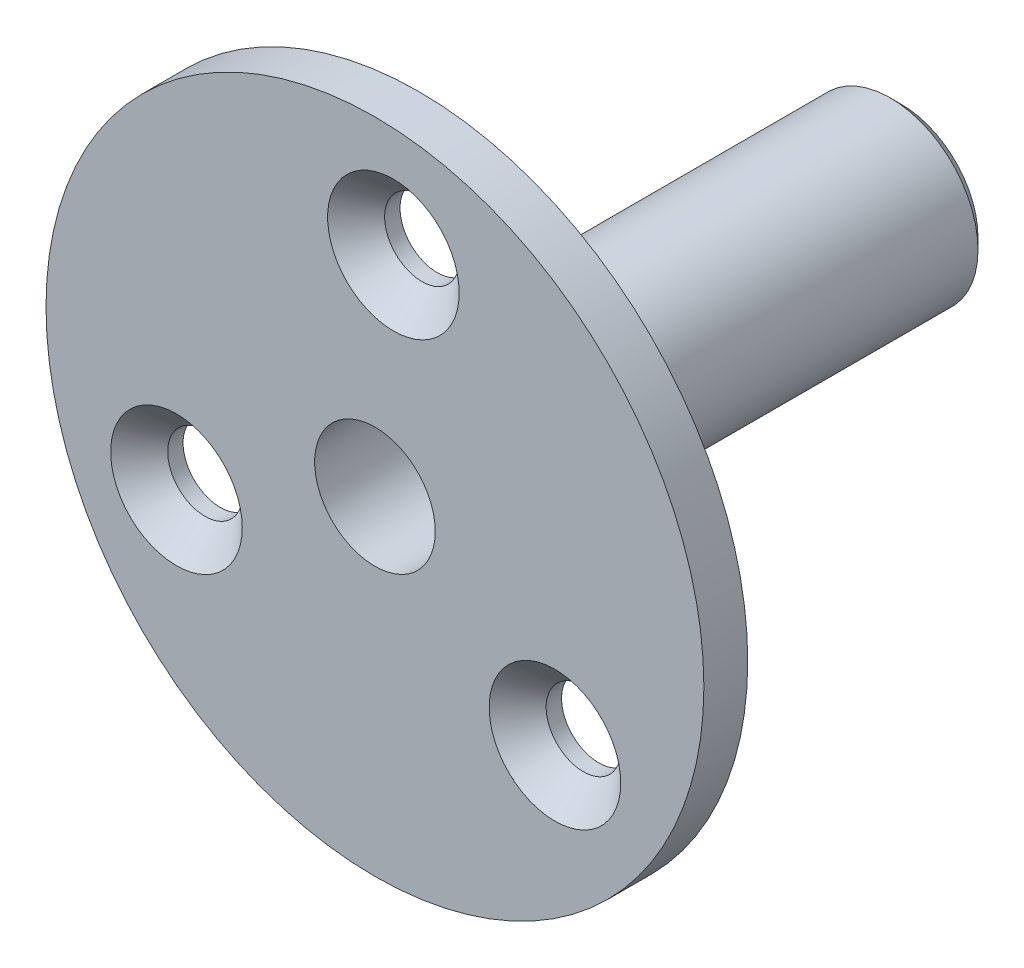
ISO-10303-21;
HEADER;
FILE_DESCRIPTION(('STEP AP214'),'2;1');
FILE_NAME('part.step','',(''),(''),'','','');
FILE_SCHEMA(('AUTOMOTIVE_DESIGN { 1 0 10303 214 1 1 1 1 }'));
ENDSEC;
DATA;
#1=APPLICATION_CONTEXT('core data for automotive mechanical design processes');
#2=APPLICATION_PROTOCOL_DEFINITION('international standard','automotive_design',2000,#1);
#3=PRODUCT_CONTEXT('',#1,'mechanical');
#4=PRODUCT('Part','Part','',(#3));
#5=PRODUCT_RELATED_PRODUCT_CATEGORY('part','',(#4));
#6=PRODUCT_DEFINITION_FORMATION('','',#4);
#7=PRODUCT_DEFINITION_CONTEXT('part definition',#1,'design');
#8=PRODUCT_DEFINITION('design','',#6,#7);
#9=PRODUCT_DEFINITION_SHAPE('','',#8);
#10=(LENGTH_UNIT() NAMED_UNIT(*) SI_UNIT(.MILLI.,.METRE.));
#11=(NAMED_UNIT(*) PLANE_ANGLE_UNIT() SI_UNIT($,.RADIAN.));
#12=(NAMED_UNIT(*) SI_UNIT($,.STERADIAN.) SOLID_ANGLE_UNIT());
#13=UNCERTAINTY_MEASURE_WITH_UNIT(LENGTH_MEASURE(1.E-05),#10,'distance_accuracy_value','');
#14=(GEOMETRIC_REPRESENTATION_CONTEXT(3) GLOBAL_UNCERTAINTY_ASSIGNED_CONTEXT((#13)) GLOBAL_UNIT_ASSIGNED_CONTEXT((#10,
#11,#12)) REPRESENTATION_CONTEXT('',''));
#15=CARTESIAN_POINT('',(0.,0.,0.));
#16=DIRECTION('',(0.,0.,1.));
#17=DIRECTION('',(1.,0.,0.));
#18=AXIS2_PLACEMENT_3D('',#15,#16,#17);
#19=CARTESIAN_POINT('',(0.,0.,2.));
#20=DIRECTION('',(0.,0.,1.));
#21=DIRECTION('',(1.,0.,0.));
#22=AXIS2_PLACEMENT_3D('',#19,#20,#21);
#23=PLANE('',#22);
#24=CARTESIAN_POINT('',(8.20835559815152,-5.7116458551187,2.));
#25=DIRECTION('',(0.,0.,1.));
#26=DIRECTION('',(1.,0.,0.));
#27=AXIS2_PLACEMENT_3D('',#24,#25,#26);
#28=CIRCLE('',#27,3.);
#29=CARTESIAN_POINT('',(11.2083555981515,-5.7116458551187,2.));
#30=VERTEX_POINT('',#29);
#31=EDGE_CURVE('E54',#30,#30,#28,.T.);
#32=ORIENTED_EDGE('',*,*,#31,.F.);
#33=EDGE_LOOP('',(#32));
#34=FACE_BOUND('',#33,.T.);
#35=CARTESIAN_POINT('',(0.,0.,2.));
#36=DIRECTION('',(0.,0.,1.));
#37=DIRECTION('',(1.,0.,0.));
#38=AXIS2_PLACEMENT_3D('',#35,#36,#37);
#39=CIRCLE('',#38,2.75);
#40=CARTESIAN_POINT('',(2.75,0.,2.));
#41=VERTEX_POINT('',#40);
#42=EDGE_CURVE('E63',#41,#41,#39,.T.);
#43=ORIENTED_EDGE('',*,*,#42,.F.);
#44=EDGE_LOOP('',(#43));
#45=FACE_BOUND('',#44,.T.);
#46=CARTESIAN_POINT('',(0.,0.,2.));
#47=DIRECTION('',(0.,0.,1.));
#48=DIRECTION('',(1.,0.,0.));
#49=AXIS2_PLACEMENT_3D('',#46,#47,#48);
#50=CIRCLE('',#49,15.);
#51=CARTESIAN_POINT('',(15.,0.,2.));
#52=VERTEX_POINT('',#51);
#53=EDGE_CURVE('E39',#52,#52,#50,.T.);
#54=ORIENTED_EDGE('',*,*,#53,.T.);
#55=EDGE_LOOP('',(#54));
#56=FACE_BOUND('',#55,.T.);
#57=CARTESIAN_POINT('',(-9.05060820702866,-4.25282154373604,2.));
#58=DIRECTION('',(0.,0.,1.));
#59=DIRECTION('',(1.,0.,0.));
#60=AXIS2_PLACEMENT_3D('',#57,#58,#59);
#61=CIRCLE('',#60,3.);
#62=CARTESIAN_POINT('',(-6.05060820702867,-4.25282154373604,2.));
#63=VERTEX_POINT('',#62);
#64=EDGE_CURVE('E59',#63,#63,#61,.T.);
#65=ORIENTED_EDGE('',*,*,#64,.F.);
#66=EDGE_LOOP('',(#65));
#67=FACE_BOUND('',#66,.T.);
#68=CARTESIAN_POINT('',(0.842252608877078,9.96446739885478,2.));
#69=DIRECTION('',(0.,0.,1.));
#70=DIRECTION('',(1.,0.,0.));
#71=AXIS2_PLACEMENT_3D('',#68,#69,#70);
#72=CIRCLE('',#71,3.);
#73=CARTESIAN_POINT('',(3.84225260887708,9.96446739885478,2.));
#74=VERTEX_POINT('',#73);
#75=EDGE_CURVE('E49',#74,#74,#72,.T.);
#76=ORIENTED_EDGE('',*,*,#75,.F.);
#77=EDGE_LOOP('',(#76));
#78=FACE_BOUND('',#77,.T.);
#79=ADVANCED_FACE('F28',(#34,#45,#56,#67,#78),#23,.T.);
#80=CARTESIAN_POINT('',(0.,0.,0.));
#81=DIRECTION('',(0.,0.,1.));
#82=DIRECTION('',(1.,0.,0.));
#83=AXIS2_PLACEMENT_3D('',#80,#81,#82);
#84=PLANE('',#83);
#85=CARTESIAN_POINT('',(0.,0.,0.));
#86=DIRECTION('',(0.,0.,-1.));
#87=DIRECTION('',(-1.,0.,0.));
#88=AXIS2_PLACEMENT_3D('',#85,#86,#87);
#89=CIRCLE('',#88,3.9);
#90=CARTESIAN_POINT('',(-3.9,0.,0.));
#91=VERTEX_POINT('',#90);
#92=EDGE_CURVE('E87',#91,#91,#89,.T.);
#93=ORIENTED_EDGE('',*,*,#92,.F.);
#94=EDGE_LOOP('',(#93));
#95=FACE_BOUND('',#94,.T.);
#96=CARTESIAN_POINT('',(0.842252608877078,9.96446739885478,0.));
#97=DIRECTION('',(0.,0.,1.));
#98=DIRECTION('',(1.,0.,0.));
#99=AXIS2_PLACEMENT_3D('',#96,#97,#98);
#100=CIRCLE('',#99,1.69999999999999);
#101=CARTESIAN_POINT('',(2.54225260887707,9.96446739885478,0.));
#102=VERTEX_POINT('',#101);
#103=EDGE_CURVE('E51',#102,#102,#100,.F.);
#104=ORIENTED_EDGE('',*,*,#103,.F.);
#105=EDGE_LOOP('',(#104));
#106=FACE_BOUND('',#105,.T.);
#107=CARTESIAN_POINT('',(-9.05060820702866,-4.25282154373604,0.));
#108=DIRECTION('',(0.,0.,1.));
#109=DIRECTION('',(1.,0.,0.));
#110=AXIS2_PLACEMENT_3D('',#107,#108,#109);
#111=CIRCLE('',#110,1.69999999999999);
#112=CARTESIAN_POINT('',(-7.35060820702867,-4.25282154373604,0.));
#113=VERTEX_POINT('',#112);
#114=EDGE_CURVE('E61',#113,#113,#111,.F.);
#115=ORIENTED_EDGE('',*,*,#114,.F.);
#116=EDGE_LOOP('',(#115));
#117=FACE_BOUND('',#116,.T.);
#118=CARTESIAN_POINT('',(0.,0.,0.));
#119=DIRECTION('',(0.,0.,1.));
#120=DIRECTION('',(1.,0.,0.));
#121=AXIS2_PLACEMENT_3D('',#118,#119,#120);
#122=CIRCLE('',#121,15.);
#123=CARTESIAN_POINT('',(15.,0.,0.));
#124=VERTEX_POINT('',#123);
#125=EDGE_CURVE('E43',#124,#124,#122,.T.);
#126=ORIENTED_EDGE('',*,*,#125,.F.);
#127=EDGE_LOOP('',(#126));
#128=FACE_BOUND('',#127,.T.);
#129=CARTESIAN_POINT('',(8.20835559815152,-5.7116458551187,0.));
#130=DIRECTION('',(0.,0.,1.));
#131=DIRECTION('',(1.,0.,0.));
#132=AXIS2_PLACEMENT_3D('',#129,#130,#131);
#133=CIRCLE('',#132,1.69999999999999);
#134=CARTESIAN_POINT('',(9.90835559815151,-5.7116458551187,0.));
#135=VERTEX_POINT('',#134);
#136=EDGE_CURVE('E56',#135,#135,#133,.F.);
#137=ORIENTED_EDGE('',*,*,#136,.F.);
#138=EDGE_LOOP('',(#137));
#139=FACE_BOUND('',#138,.T.);
#140=ADVANCED_FACE('F93',(#95,#106,#117,#128,#139),#84,.F.);
#141=CARTESIAN_POINT('',(0.,0.,-22.));
#142=DIRECTION('',(0.,0.,1.));
#143=DIRECTION('',(1.,0.,0.));
#144=AXIS2_PLACEMENT_3D('',#141,#142,#143);
#145=PLANE('',#144);
#146=CARTESIAN_POINT('',(0.,0.,-22.));
#147=DIRECTION('',(0.,0.,1.));
#148=DIRECTION('',(1.,0.,0.));
#149=AXIS2_PLACEMENT_3D('',#146,#147,#148);
#150=CIRCLE('',#149,3.5);
#151=CARTESIAN_POINT('',(3.5,0.,-22.));
#152=VERTEX_POINT('',#151);
#153=EDGE_CURVE('E10',#152,#152,#150,.F.);
#154=ORIENTED_EDGE('',*,*,#153,.T.);
#155=EDGE_LOOP('',(#154));
#156=FACE_BOUND('',#155,.T.);
#157=CARTESIAN_POINT('',(0.,0.,-22.));
#158=DIRECTION('',(0.,0.,1.));
#159=DIRECTION('',(1.,0.,0.));
#160=AXIS2_PLACEMENT_3D('',#157,#158,#159);
#161=CIRCLE('',#160,2.75);
#162=CARTESIAN_POINT('',(2.75,0.,-22.));
#163=VERTEX_POINT('',#162);
#164=EDGE_CURVE('E68',#163,#163,#161,.T.);
#165=ORIENTED_EDGE('',*,*,#164,.T.);
#166=EDGE_LOOP('',(#165));
#167=FACE_BOUND('',#166,.T.);
#168=ADVANCED_FACE('F96',(#156,#167),#145,.F.);
#169=CARTESIAN_POINT('',(0.,0.,2.));
#170=DIRECTION('',(0.,0.,-1.));
#171=DIRECTION('',(-1.,0.,0.));
#172=AXIS2_PLACEMENT_3D('',#169,#170,#171);
#173=CYLINDRICAL_SURFACE('',#172,15.);
#174=ORIENTED_EDGE('',*,*,#53,.F.);
#175=EDGE_LOOP('',(#174));
#176=FACE_BOUND('',#175,.T.);
#177=ORIENTED_EDGE('',*,*,#125,.T.);
#178=EDGE_LOOP('',(#177));
#179=FACE_BOUND('',#178,.T.);
#180=ADVANCED_FACE('F30',(#176,#179),#173,.T.);
#181=CARTESIAN_POINT('',(0.,0.,-22.));
#182=DIRECTION('',(0.,0.,1.));
#183=DIRECTION('',(1.,0.,0.));
#184=AXIS2_PLACEMENT_3D('',#181,#182,#183);
#185=CYLINDRICAL_SURFACE('',#184,4.);
#186=CARTESIAN_POINT('',(0.,0.,-21.5));
#187=DIRECTION('',(0.,0.,1.));
#188=DIRECTION('',(1.,0.,0.));
#189=AXIS2_PLACEMENT_3D('',#186,#187,#188);
#190=CIRCLE('',#189,4.);
#191=CARTESIAN_POINT('',(4.,0.,-21.5));
#192=VERTEX_POINT('',#191);
#193=EDGE_CURVE('E35',#192,#192,#190,.T.);
#194=ORIENTED_EDGE('',*,*,#193,.T.);
#195=EDGE_LOOP('',(#194));
#196=FACE_BOUND('',#195,.T.);
#197=CARTESIAN_POINT('',(0.,0.,-0.5));
#198=DIRECTION('',(0.,0.,-1.));
#199=DIRECTION('',(-1.,0.,0.));
#200=AXIS2_PLACEMENT_3D('',#197,#198,#199);
#201=CIRCLE('',#200,4.);
#202=CARTESIAN_POINT('',(-4.,0.,-0.5));
#203=VERTEX_POINT('',#202);
#204=EDGE_CURVE('E46',#203,#203,#201,.F.);
#205=ORIENTED_EDGE('',*,*,#204,.F.);
#206=EDGE_LOOP('',(#205));
#207=FACE_BOUND('',#206,.T.);
#208=ADVANCED_FACE('F129',(#196,#207),#185,.T.);
#209=CARTESIAN_POINT('',(0.,0.,2.));
#210=DIRECTION('',(0.,0.,1.));
#211=DIRECTION('',(1.,0.,0.));
#212=AXIS2_PLACEMENT_3D('',#209,#210,#211);
#213=CYLINDRICAL_SURFACE('',#212,2.75);
#214=ORIENTED_EDGE('',*,*,#42,.T.);
#215=EDGE_LOOP('',(#214));
#216=FACE_BOUND('',#215,.T.);
#217=ORIENTED_EDGE('',*,*,#164,.F.);
#218=EDGE_LOOP('',(#217));
#219=FACE_BOUND('',#218,.T.);
#220=ADVANCED_FACE('F132',(#216,#219),#213,.F.);
#221=CARTESIAN_POINT('',(-9.05060820702866,-4.25282154373604,2.));
#222=DIRECTION('',(0.,0.,1.));
#223=DIRECTION('',(1.,0.,0.));
#224=AXIS2_PLACEMENT_3D('',#221,#222,#223);
#225=CYLINDRICAL_SURFACE('',#224,1.69999999999999);
#226=CARTESIAN_POINT('',(-9.05060820702866,-4.25282154373604,0.699999999999991));
#227=DIRECTION('',(0.,0.,1.));
#228=DIRECTION('',(1.,0.,0.));
#229=AXIS2_PLACEMENT_3D('',#226,#227,#228);
#230=CIRCLE('',#229,1.69999999999999);
#231=CARTESIAN_POINT('',(-7.35060820702868,-4.25282154373604,0.699999999999991));
#232=VERTEX_POINT('',#231);
#233=EDGE_CURVE('E64',#232,#232,#230,.T.);
#234=ORIENTED_EDGE('',*,*,#233,.T.);
#235=EDGE_LOOP('',(#234));
#236=FACE_BOUND('',#235,.T.);
#237=ORIENTED_EDGE('',*,*,#114,.T.);
#238=EDGE_LOOP('',(#237));
#239=FACE_BOUND('',#238,.T.);
#240=ADVANCED_FACE('F119',(#236,#239),#225,.F.);
#241=CARTESIAN_POINT('',(-9.05060820702866,-4.25282154373604,0.699999999999991));
#242=DIRECTION('',(0.,0.,1.));
#243=DIRECTION('',(1.,0.,0.));
#244=AXIS2_PLACEMENT_3D('',#241,#242,#243);
#245=CONICAL_SURFACE('',#244,1.69999999999999,0.78539816339745);
#246=ORIENTED_EDGE('',*,*,#64,.T.);
#247=EDGE_LOOP('',(#246));
#248=FACE_BOUND('',#247,.T.);
#249=ORIENTED_EDGE('',*,*,#233,.F.);
#250=EDGE_LOOP('',(#249));
#251=FACE_BOUND('',#250,.T.);
#252=ADVANCED_FACE('F109',(#248,#251),#245,.F.);
#253=CARTESIAN_POINT('',(8.20835559815152,-5.7116458551187,2.));
#254=DIRECTION('',(0.,0.,1.));
#255=DIRECTION('',(1.,0.,0.));
#256=AXIS2_PLACEMENT_3D('',#253,#254,#255);
#257=CYLINDRICAL_SURFACE('',#256,1.69999999999999);
#258=CARTESIAN_POINT('',(8.20835559815152,-5.7116458551187,0.699999999999991));
#259=DIRECTION('',(0.,0.,1.));
#260=DIRECTION('',(1.,0.,0.));
#261=AXIS2_PLACEMENT_3D('',#258,#259,#260);
#262=CIRCLE('',#261,1.69999999999999);
#263=CARTESIAN_POINT('',(9.90835559815151,-5.7116458551187,0.699999999999991));
#264=VERTEX_POINT('',#263);
#265=EDGE_CURVE('E60',#264,#264,#262,.T.);
#266=ORIENTED_EDGE('',*,*,#265,.T.);
#267=EDGE_LOOP('',(#266));
#268=FACE_BOUND('',#267,.T.);
#269=ORIENTED_EDGE('',*,*,#136,.T.);
#270=EDGE_LOOP('',(#269));
#271=FACE_BOUND('',#270,.T.);
#272=ADVANCED_FACE('F106',(#268,#271),#257,.F.);
#273=CARTESIAN_POINT('',(8.20835559815152,-5.7116458551187,0.699999999999991));
#274=DIRECTION('',(0.,0.,1.));
#275=DIRECTION('',(1.,0.,0.));
#276=AXIS2_PLACEMENT_3D('',#273,#274,#275);
#277=CONICAL_SURFACE('',#276,1.69999999999999,0.78539816339745);
#278=ORIENTED_EDGE('',*,*,#31,.T.);
#279=EDGE_LOOP('',(#278));
#280=FACE_BOUND('',#279,.T.);
#281=ORIENTED_EDGE('',*,*,#265,.F.);
#282=EDGE_LOOP('',(#281));
#283=FACE_BOUND('',#282,.T.);
#284=ADVANCED_FACE('F108',(#280,#283),#277,.F.);
#285=CARTESIAN_POINT('',(0.842252608877078,9.96446739885478,2.));
#286=DIRECTION('',(0.,0.,1.));
#287=DIRECTION('',(1.,0.,0.));
#288=AXIS2_PLACEMENT_3D('',#285,#286,#287);
#289=CYLINDRICAL_SURFACE('',#288,1.69999999999999);
#290=CARTESIAN_POINT('',(0.842252608877078,9.96446739885478,0.699999999999991));
#291=DIRECTION('',(0.,0.,1.));
#292=DIRECTION('',(1.,0.,0.));
#293=AXIS2_PLACEMENT_3D('',#290,#291,#292);
#294=CIRCLE('',#293,1.69999999999999);
#295=CARTESIAN_POINT('',(2.54225260887707,9.96446739885478,0.699999999999991));
#296=VERTEX_POINT('',#295);
#297=EDGE_CURVE('E55',#296,#296,#294,.T.);
#298=ORIENTED_EDGE('',*,*,#297,.T.);
#299=EDGE_LOOP('',(#298));
#300=FACE_BOUND('',#299,.T.);
#301=ORIENTED_EDGE('',*,*,#103,.T.);
#302=EDGE_LOOP('',(#301));
#303=FACE_BOUND('',#302,.T.);
#304=ADVANCED_FACE('F116',(#300,#303),#289,.F.);
#305=CARTESIAN_POINT('',(0.842252608877078,9.96446739885478,0.699999999999991));
#306=DIRECTION('',(0.,0.,1.));
#307=DIRECTION('',(1.,0.,0.));
#308=AXIS2_PLACEMENT_3D('',#305,#306,#307);
#309=CONICAL_SURFACE('',#308,1.69999999999999,0.78539816339745);
#310=ORIENTED_EDGE('',*,*,#75,.T.);
#311=EDGE_LOOP('',(#310));
#312=FACE_BOUND('',#311,.T.);
#313=ORIENTED_EDGE('',*,*,#297,.F.);
#314=EDGE_LOOP('',(#313));
#315=FACE_BOUND('',#314,.T.);
#316=ADVANCED_FACE('F172',(#312,#315),#309,.F.);
#317=CARTESIAN_POINT('',(0.,0.,-0.5));
#318=DIRECTION('',(0.,0.,-1.));
#319=DIRECTION('',(-1.,0.,0.));
#320=AXIS2_PLACEMENT_3D('',#317,#318,#319);
#321=PLANE('',#320);
#322=ORIENTED_EDGE('',*,*,#204,.T.);
#323=EDGE_LOOP('',(#322));
#324=FACE_BOUND('',#323,.T.);
#325=CARTESIAN_POINT('',(0.,0.,-0.5));
#326=DIRECTION('',(0.,0.,-1.));
#327=DIRECTION('',(-1.,0.,0.));
#328=AXIS2_PLACEMENT_3D('',#325,#326,#327);
#329=CIRCLE('',#328,3.9);
#330=CARTESIAN_POINT('',(-3.9,0.,-0.5));
#331=VERTEX_POINT('',#330);
#332=EDGE_CURVE('E50',#331,#331,#329,.T.);
#333=ORIENTED_EDGE('',*,*,#332,.T.);
#334=EDGE_LOOP('',(#333));
#335=FACE_BOUND('',#334,.T.);
#336=ADVANCED_FACE('F182',(#324,#335),#321,.F.);
#337=CARTESIAN_POINT('',(0.,0.,-0.5));
#338=DIRECTION('',(0.,0.,1.));
#339=DIRECTION('',(1.,0.,0.));
#340=AXIS2_PLACEMENT_3D('',#337,#338,#339);
#341=CYLINDRICAL_SURFACE('',#340,3.9);
#342=ORIENTED_EDGE('',*,*,#332,.F.);
#343=EDGE_LOOP('',(#342));
#344=FACE_BOUND('',#343,.T.);
#345=ORIENTED_EDGE('',*,*,#92,.T.);
#346=EDGE_LOOP('',(#345));
#347=FACE_BOUND('',#346,.T.);
#348=ADVANCED_FACE('F91',(#344,#347),#341,.T.);
#349=CARTESIAN_POINT('',(0.,0.,-21.5));
#350=DIRECTION('',(0.,0.,1.));
#351=DIRECTION('',(1.,0.,0.));
#352=AXIS2_PLACEMENT_3D('',#349,#350,#351);
#353=CONICAL_SURFACE('',#352,4.,0.785398163397445);
#354=ORIENTED_EDGE('',*,*,#153,.F.);
#355=EDGE_LOOP('',(#354));
#356=FACE_BOUND('',#355,.T.);
#357=ORIENTED_EDGE('',*,*,#193,.F.);
#358=EDGE_LOOP('',(#357));
#359=FACE_BOUND('',#358,.T.);
#360=ADVANCED_FACE('F202',(#356,#359),#353,.T.);
#361=CLOSED_SHELL('',(#79,#140,#168,#180,#208,#220,#240,#252,#272,#284,#304,#316,#336,#348,#360));
#362=MANIFOLD_SOLID_BREP('B2',#361);
#363=ADVANCED_BREP_SHAPE_REPRESENTATION('',(#18,#362),#14);
#364=SHAPE_DEFINITION_REPRESENTATION(#9,#363);
ENDSEC;
END-ISO-10303-21;
